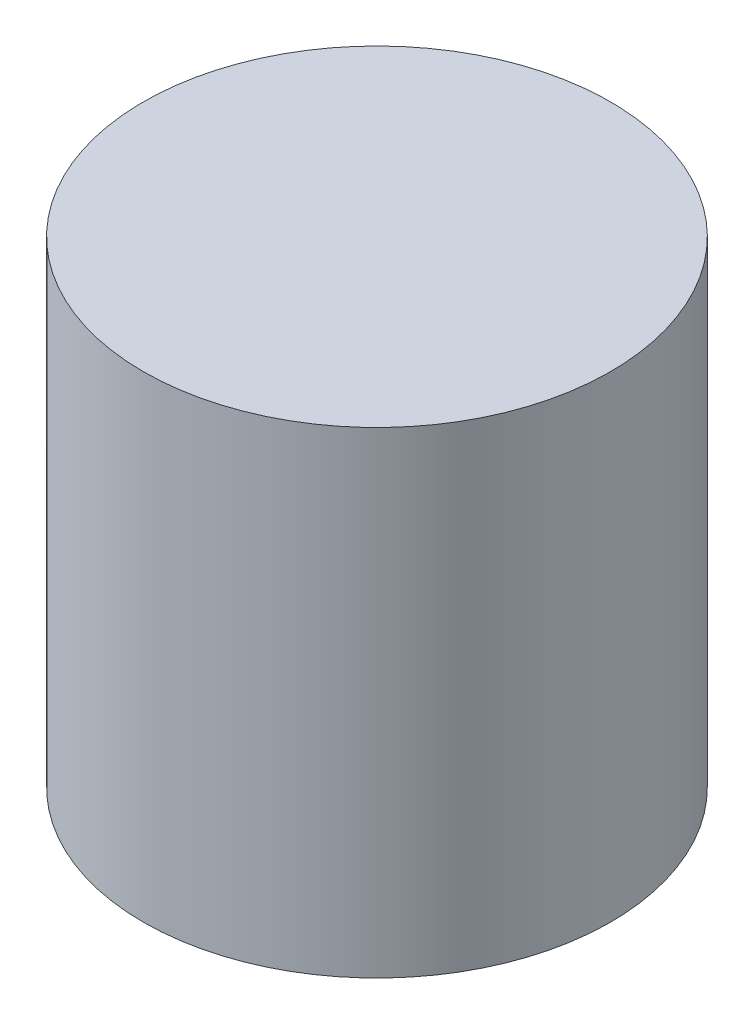
ISO-10303-21;
HEADER;
FILE_DESCRIPTION(('STEP AP214'),'2;1');
FILE_NAME('part.step','',(''),(''),'','','');
FILE_SCHEMA(('AUTOMOTIVE_DESIGN { 1 0 10303 214 1 1 1 1 }'));
ENDSEC;
DATA;
#1=APPLICATION_CONTEXT('core data for automotive mechanical design processes');
#2=APPLICATION_PROTOCOL_DEFINITION('international standard','automotive_design',2000,#1);
#3=PRODUCT_CONTEXT('',#1,'mechanical');
#4=PRODUCT('Part','Part','',(#3));
#5=PRODUCT_RELATED_PRODUCT_CATEGORY('part','',(#4));
#6=PRODUCT_DEFINITION_FORMATION('','',#4);
#7=PRODUCT_DEFINITION_CONTEXT('part definition',#1,'design');
#8=PRODUCT_DEFINITION('design','',#6,#7);
#9=PRODUCT_DEFINITION_SHAPE('','',#8);
#10=(LENGTH_UNIT() NAMED_UNIT(*) SI_UNIT(.MILLI.,.METRE.));
#11=(NAMED_UNIT(*) PLANE_ANGLE_UNIT() SI_UNIT($,.RADIAN.));
#12=(NAMED_UNIT(*) SI_UNIT($,.STERADIAN.) SOLID_ANGLE_UNIT());
#13=UNCERTAINTY_MEASURE_WITH_UNIT(LENGTH_MEASURE(1.E-05),#10,'distance_accuracy_value','');
#14=(GEOMETRIC_REPRESENTATION_CONTEXT(3) GLOBAL_UNCERTAINTY_ASSIGNED_CONTEXT((#13)) GLOBAL_UNIT_ASSIGNED_CONTEXT((#10,
#11,#12)) REPRESENTATION_CONTEXT('',''));
#15=CARTESIAN_POINT('',(0.,0.,0.));
#16=DIRECTION('',(0.,0.,1.));
#17=DIRECTION('',(1.,0.,0.));
#18=AXIS2_PLACEMENT_3D('',#15,#16,#17);
#19=CARTESIAN_POINT('',(0.,10.,0.));
#20=DIRECTION('',(0.,-1.,0.));
#21=DIRECTION('',(0.,0.,-1.));
#22=AXIS2_PLACEMENT_3D('',#19,#20,#21);
#23=CYLINDRICAL_SURFACE('',#22,4.9);
#24=CARTESIAN_POINT('',(0.,10.,0.));
#25=DIRECTION('',(0.,1.,0.));
#26=DIRECTION('',(0.,0.,1.));
#27=AXIS2_PLACEMENT_3D('',#24,#25,#26);
#28=CIRCLE('',#27,4.9);
#29=CARTESIAN_POINT('',(0.,10.,4.9));
#30=VERTEX_POINT('',#29);
#31=EDGE_CURVE('E10',#30,#30,#28,.T.);
#32=ORIENTED_EDGE('',*,*,#31,.F.);
#33=EDGE_LOOP('',(#32));
#34=FACE_BOUND('',#33,.T.);
#35=CARTESIAN_POINT('',(0.,0.,0.));
#36=DIRECTION('',(0.,1.,0.));
#37=DIRECTION('',(0.,0.,1.));
#38=AXIS2_PLACEMENT_3D('',#35,#36,#37);
#39=CIRCLE('',#38,4.9);
#40=CARTESIAN_POINT('',(0.,0.,4.9));
#41=VERTEX_POINT('',#40);
#42=EDGE_CURVE('E34',#41,#41,#39,.T.);
#43=ORIENTED_EDGE('',*,*,#42,.T.);
#44=EDGE_LOOP('',(#43));
#45=FACE_BOUND('',#44,.T.);
#46=ADVANCED_FACE('F31',(#34,#45),#23,.T.);
#47=CARTESIAN_POINT('',(0.,10.,0.));
#48=DIRECTION('',(0.,1.,0.));
#49=DIRECTION('',(0.,0.,1.));
#50=AXIS2_PLACEMENT_3D('',#47,#48,#49);
#51=PLANE('',#50);
#52=ORIENTED_EDGE('',*,*,#31,.T.);
#53=EDGE_LOOP('',(#52));
#54=FACE_BOUND('',#53,.T.);
#55=ADVANCED_FACE('F46',(#54),#51,.T.);
#56=CARTESIAN_POINT('',(0.,0.,0.));
#57=DIRECTION('',(0.,1.,0.));
#58=DIRECTION('',(0.,0.,1.));
#59=AXIS2_PLACEMENT_3D('',#56,#57,#58);
#60=PLANE('',#59);
#61=ORIENTED_EDGE('',*,*,#42,.F.);
#62=EDGE_LOOP('',(#61));
#63=FACE_BOUND('',#62,.T.);
#64=ADVANCED_FACE('F44',(#63),#60,.F.);
#65=CLOSED_SHELL('',(#46,#55,#64));
#66=MANIFOLD_SOLID_BREP('B2',#65);
#67=ADVANCED_BREP_SHAPE_REPRESENTATION('',(#18,#66),#14);
#68=SHAPE_DEFINITION_REPRESENTATION(#9,#67);
ENDSEC;
END-ISO-10303-21;
